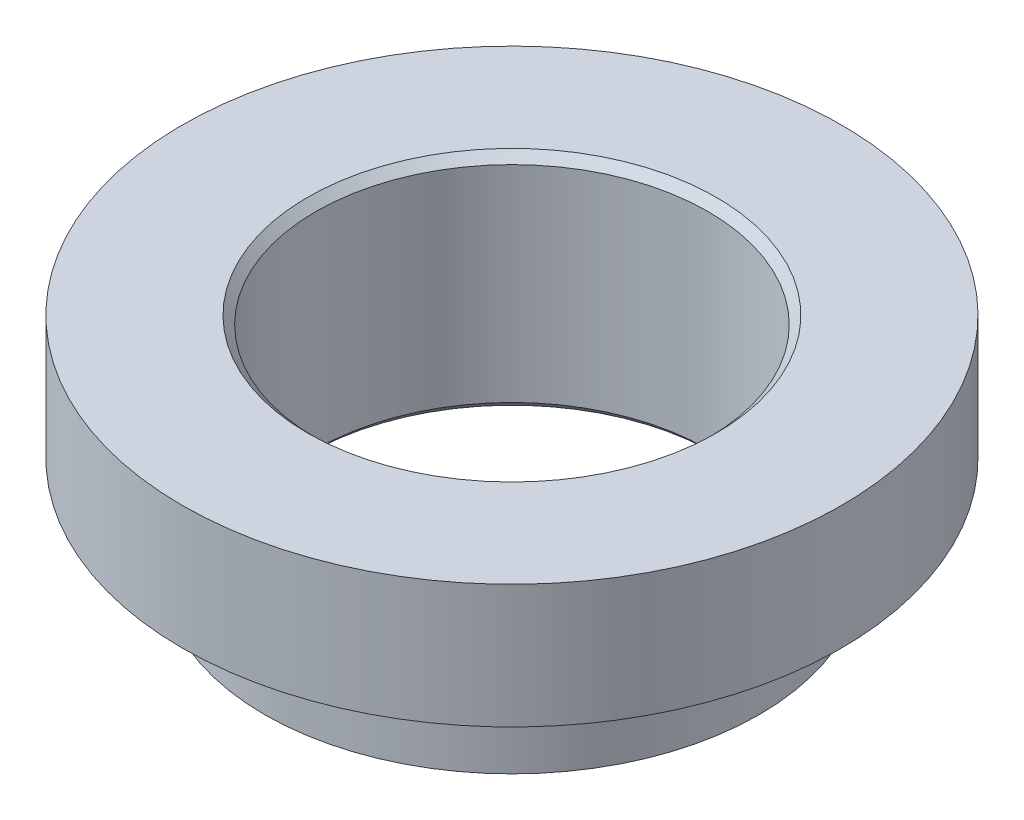
ISO-10303-21;
HEADER;
FILE_DESCRIPTION(('STEP AP214'),'2;1');
FILE_NAME('part.step','',(''),(''),'','','');
FILE_SCHEMA(('AUTOMOTIVE_DESIGN { 1 0 10303 214 1 1 1 1 }'));
ENDSEC;
DATA;
#1=APPLICATION_CONTEXT('core data for automotive mechanical design processes');
#2=APPLICATION_PROTOCOL_DEFINITION('international standard','automotive_design',2000,#1);
#3=PRODUCT_CONTEXT('',#1,'mechanical');
#4=PRODUCT('Part','Part','',(#3));
#5=PRODUCT_RELATED_PRODUCT_CATEGORY('part','',(#4));
#6=PRODUCT_DEFINITION_FORMATION('','',#4);
#7=PRODUCT_DEFINITION_CONTEXT('part definition',#1,'design');
#8=PRODUCT_DEFINITION('design','',#6,#7);
#9=PRODUCT_DEFINITION_SHAPE('','',#8);
#10=(LENGTH_UNIT() NAMED_UNIT(*) SI_UNIT(.MILLI.,.METRE.));
#11=(NAMED_UNIT(*) PLANE_ANGLE_UNIT() SI_UNIT($,.RADIAN.));
#12=(NAMED_UNIT(*) SI_UNIT($,.STERADIAN.) SOLID_ANGLE_UNIT());
#13=UNCERTAINTY_MEASURE_WITH_UNIT(LENGTH_MEASURE(1.E-05),#10,'distance_accuracy_value','');
#14=(GEOMETRIC_REPRESENTATION_CONTEXT(3) GLOBAL_UNCERTAINTY_ASSIGNED_CONTEXT((#13)) GLOBAL_UNIT_ASSIGNED_CONTEXT((#10,
#11,#12)) REPRESENTATION_CONTEXT('',''));
#15=CARTESIAN_POINT('',(0.,0.,0.));
#16=DIRECTION('',(0.,0.,1.));
#17=DIRECTION('',(1.,0.,0.));
#18=AXIS2_PLACEMENT_3D('',#15,#16,#17);
#19=CARTESIAN_POINT('',(0.,0.,0.));
#20=DIRECTION('',(0.,1.,0.));
#21=DIRECTION('',(0.,0.,1.));
#22=AXIS2_PLACEMENT_3D('',#19,#20,#21);
#23=CYLINDRICAL_SURFACE('',#22,20.);
#24=CARTESIAN_POINT('',(0.,-7.5,0.));
#25=DIRECTION('',(0.,1.,0.));
#26=DIRECTION('',(0.,0.,1.));
#27=AXIS2_PLACEMENT_3D('',#24,#25,#26);
#28=CIRCLE('',#27,20.);
#29=CARTESIAN_POINT('',(0.,-7.5,20.));
#30=VERTEX_POINT('',#29);
#31=EDGE_CURVE('E10',#30,#30,#28,.T.);
#32=ORIENTED_EDGE('',*,*,#31,.T.);
#33=EDGE_LOOP('',(#32));
#34=FACE_BOUND('',#33,.T.);
#35=CARTESIAN_POINT('',(0.,0.,0.));
#36=DIRECTION('',(0.,1.,0.));
#37=DIRECTION('',(0.,0.,1.));
#38=AXIS2_PLACEMENT_3D('',#35,#36,#37);
#39=CIRCLE('',#38,20.);
#40=CARTESIAN_POINT('',(0.,0.,20.));
#41=VERTEX_POINT('',#40);
#42=EDGE_CURVE('E56',#41,#41,#39,.T.);
#43=ORIENTED_EDGE('',*,*,#42,.F.);
#44=EDGE_LOOP('',(#43));
#45=FACE_BOUND('',#44,.T.);
#46=ADVANCED_FACE('F28',(#34,#45),#23,.T.);
#47=CARTESIAN_POINT('',(-20.,-7.5,0.));
#48=DIRECTION('',(0.,-1.,0.));
#49=DIRECTION('',(0.,0.,-1.));
#50=AXIS2_PLACEMENT_3D('',#47,#48,#49);
#51=PLANE('',#50);
#52=CARTESIAN_POINT('',(0.,-7.5,0.));
#53=DIRECTION('',(0.,1.,0.));
#54=DIRECTION('',(0.,0.,1.));
#55=AXIS2_PLACEMENT_3D('',#52,#53,#54);
#56=CIRCLE('',#55,15.);
#57=CARTESIAN_POINT('',(0.,-7.5,15.));
#58=VERTEX_POINT('',#57);
#59=EDGE_CURVE('E34',#58,#58,#56,.T.);
#60=ORIENTED_EDGE('',*,*,#59,.T.);
#61=EDGE_LOOP('',(#60));
#62=FACE_BOUND('',#61,.T.);
#63=ORIENTED_EDGE('',*,*,#31,.F.);
#64=EDGE_LOOP('',(#63));
#65=FACE_BOUND('',#64,.T.);
#66=ADVANCED_FACE('F64',(#62,#65),#51,.T.);
#67=CARTESIAN_POINT('',(0.,0.,0.));
#68=DIRECTION('',(0.,1.,0.));
#69=DIRECTION('',(0.,0.,1.));
#70=AXIS2_PLACEMENT_3D('',#67,#68,#69);
#71=CYLINDRICAL_SURFACE('',#70,15.);
#72=CARTESIAN_POINT('',(0.,-13.5,0.));
#73=DIRECTION('',(0.,1.,0.));
#74=DIRECTION('',(0.,0.,1.));
#75=AXIS2_PLACEMENT_3D('',#72,#73,#74);
#76=CIRCLE('',#75,15.);
#77=CARTESIAN_POINT('',(0.,-13.5,15.));
#78=VERTEX_POINT('',#77);
#79=EDGE_CURVE('E38',#78,#78,#76,.T.);
#80=ORIENTED_EDGE('',*,*,#79,.T.);
#81=EDGE_LOOP('',(#80));
#82=FACE_BOUND('',#81,.T.);
#83=ORIENTED_EDGE('',*,*,#59,.F.);
#84=EDGE_LOOP('',(#83));
#85=FACE_BOUND('',#84,.T.);
#86=ADVANCED_FACE('F68',(#82,#85),#71,.T.);
#87=CARTESIAN_POINT('',(-15.,-13.5,0.));
#88=DIRECTION('',(0.,-1.,0.));
#89=DIRECTION('',(0.,0.,-1.));
#90=AXIS2_PLACEMENT_3D('',#87,#88,#89);
#91=PLANE('',#90);
#92=CARTESIAN_POINT('',(0.,-13.5,0.));
#93=DIRECTION('',(0.,1.,0.));
#94=DIRECTION('',(0.,0.,1.));
#95=AXIS2_PLACEMENT_3D('',#92,#93,#94);
#96=CIRCLE('',#95,12.4);
#97=CARTESIAN_POINT('',(0.,-13.5,12.4));
#98=VERTEX_POINT('',#97);
#99=EDGE_CURVE('E42',#98,#98,#96,.T.);
#100=ORIENTED_EDGE('',*,*,#99,.T.);
#101=EDGE_LOOP('',(#100));
#102=FACE_BOUND('',#101,.T.);
#103=ORIENTED_EDGE('',*,*,#79,.F.);
#104=EDGE_LOOP('',(#103));
#105=FACE_BOUND('',#104,.T.);
#106=ADVANCED_FACE('F72',(#102,#105),#91,.T.);
#107=CARTESIAN_POINT('',(0.,-13.5,0.));
#108=DIRECTION('',(0.,-1.,0.));
#109=DIRECTION('',(0.,0.,-1.));
#110=AXIS2_PLACEMENT_3D('',#107,#108,#109);
#111=CONICAL_SURFACE('',#110,12.4,0.785398163397448);
#112=CARTESIAN_POINT('',(0.,-13.,0.));
#113=DIRECTION('',(0.,1.,0.));
#114=DIRECTION('',(0.,0.,1.));
#115=AXIS2_PLACEMENT_3D('',#112,#113,#114);
#116=CIRCLE('',#115,11.9);
#117=CARTESIAN_POINT('',(0.,-13.,11.9));
#118=VERTEX_POINT('',#117);
#119=EDGE_CURVE('E47',#118,#118,#116,.T.);
#120=ORIENTED_EDGE('',*,*,#119,.T.);
#121=EDGE_LOOP('',(#120));
#122=FACE_BOUND('',#121,.T.);
#123=ORIENTED_EDGE('',*,*,#99,.F.);
#124=EDGE_LOOP('',(#123));
#125=FACE_BOUND('',#124,.T.);
#126=ADVANCED_FACE('F79',(#122,#125),#111,.F.);
#127=CARTESIAN_POINT('',(0.,0.,0.));
#128=DIRECTION('',(0.,1.,0.));
#129=DIRECTION('',(0.,0.,1.));
#130=AXIS2_PLACEMENT_3D('',#127,#128,#129);
#131=CYLINDRICAL_SURFACE('',#130,11.9);
#132=CARTESIAN_POINT('',(0.,-0.500000000000001,0.));
#133=DIRECTION('',(0.,1.,0.));
#134=DIRECTION('',(0.,0.,1.));
#135=AXIS2_PLACEMENT_3D('',#132,#133,#134);
#136=CIRCLE('',#135,11.9);
#137=CARTESIAN_POINT('',(0.,-0.500000000000001,11.9));
#138=VERTEX_POINT('',#137);
#139=EDGE_CURVE('E50',#138,#138,#136,.T.);
#140=ORIENTED_EDGE('',*,*,#139,.T.);
#141=EDGE_LOOP('',(#140));
#142=FACE_BOUND('',#141,.T.);
#143=ORIENTED_EDGE('',*,*,#119,.F.);
#144=EDGE_LOOP('',(#143));
#145=FACE_BOUND('',#144,.T.);
#146=ADVANCED_FACE('F83',(#142,#145),#131,.F.);
#147=CARTESIAN_POINT('',(0.,-0.500000000000001,0.));
#148=DIRECTION('',(0.,1.,0.));
#149=DIRECTION('',(0.,0.,1.));
#150=AXIS2_PLACEMENT_3D('',#147,#148,#149);
#151=CONICAL_SURFACE('',#150,11.9,0.785398163397448);
#152=CARTESIAN_POINT('',(0.,0.,0.));
#153=DIRECTION('',(0.,1.,0.));
#154=DIRECTION('',(0.,0.,1.));
#155=AXIS2_PLACEMENT_3D('',#152,#153,#154);
#156=CIRCLE('',#155,12.4);
#157=CARTESIAN_POINT('',(0.,0.,12.4));
#158=VERTEX_POINT('',#157);
#159=EDGE_CURVE('E53',#158,#158,#156,.T.);
#160=ORIENTED_EDGE('',*,*,#159,.T.);
#161=EDGE_LOOP('',(#160));
#162=FACE_BOUND('',#161,.T.);
#163=ORIENTED_EDGE('',*,*,#139,.F.);
#164=EDGE_LOOP('',(#163));
#165=FACE_BOUND('',#164,.T.);
#166=ADVANCED_FACE('F87',(#162,#165),#151,.F.);
#167=CARTESIAN_POINT('',(-12.4,0.,0.));
#168=DIRECTION('',(0.,1.,0.));
#169=DIRECTION('',(0.,0.,1.));
#170=AXIS2_PLACEMENT_3D('',#167,#168,#169);
#171=PLANE('',#170);
#172=ORIENTED_EDGE('',*,*,#42,.T.);
#173=EDGE_LOOP('',(#172));
#174=FACE_BOUND('',#173,.T.);
#175=ORIENTED_EDGE('',*,*,#159,.F.);
#176=EDGE_LOOP('',(#175));
#177=FACE_BOUND('',#176,.T.);
#178=ADVANCED_FACE('F60',(#174,#177),#171,.T.);
#179=CLOSED_SHELL('',(#46,#66,#86,#106,#126,#146,#166,#178));
#180=MANIFOLD_SOLID_BREP('B2',#179);
#181=ADVANCED_BREP_SHAPE_REPRESENTATION('',(#18,#180),#14);
#182=SHAPE_DEFINITION_REPRESENTATION(#9,#181);
ENDSEC;
END-ISO-10303-21;
